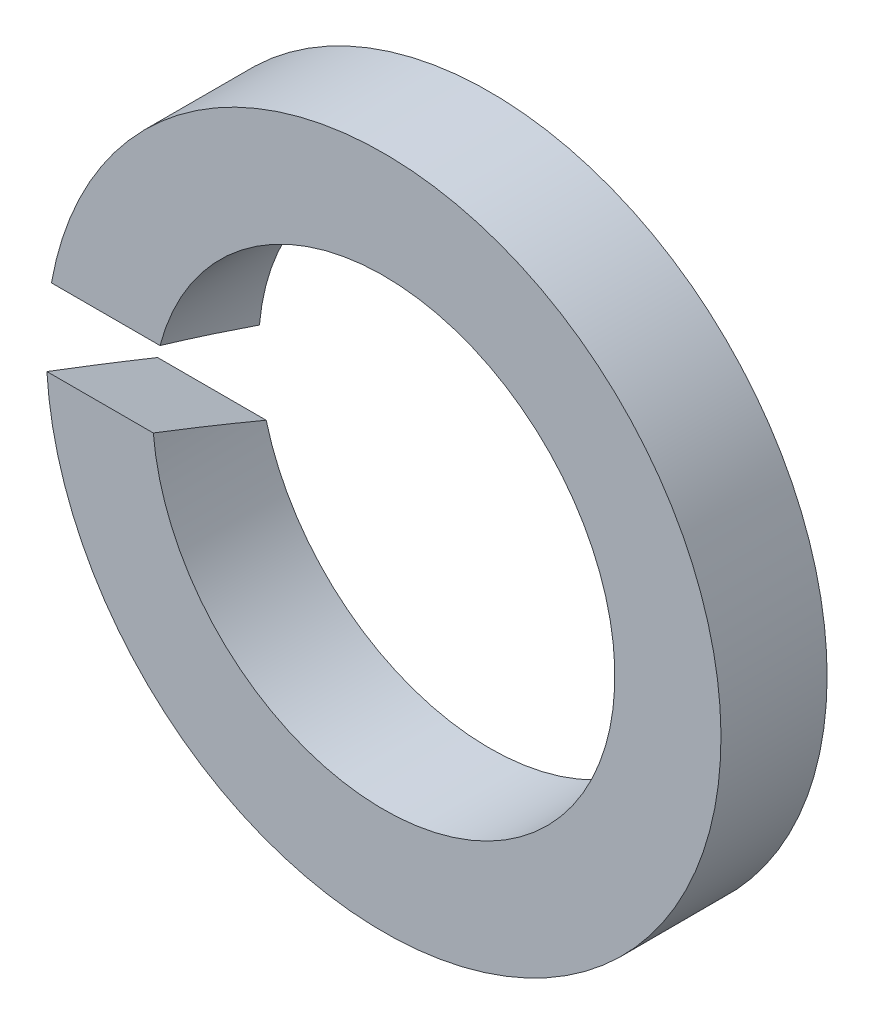
ISO-10303-21;
HEADER;
FILE_DESCRIPTION(('STEP AP214'),'2;1');
FILE_NAME('part.step','',(''),(''),'','','');
FILE_SCHEMA(('AUTOMOTIVE_DESIGN { 1 0 10303 214 1 1 1 1 }'));
ENDSEC;
DATA;
#1=APPLICATION_CONTEXT('core data for automotive mechanical design processes');
#2=APPLICATION_PROTOCOL_DEFINITION('international standard','automotive_design',2000,#1);
#3=PRODUCT_CONTEXT('',#1,'mechanical');
#4=PRODUCT('Part','Part','',(#3));
#5=PRODUCT_RELATED_PRODUCT_CATEGORY('part','',(#4));
#6=PRODUCT_DEFINITION_FORMATION('','',#4);
#7=PRODUCT_DEFINITION_CONTEXT('part definition',#1,'design');
#8=PRODUCT_DEFINITION('design','',#6,#7);
#9=PRODUCT_DEFINITION_SHAPE('','',#8);
#10=(LENGTH_UNIT() NAMED_UNIT(*) SI_UNIT(.MILLI.,.METRE.));
#11=(NAMED_UNIT(*) PLANE_ANGLE_UNIT() SI_UNIT($,.RADIAN.));
#12=(NAMED_UNIT(*) SI_UNIT($,.STERADIAN.) SOLID_ANGLE_UNIT());
#13=UNCERTAINTY_MEASURE_WITH_UNIT(LENGTH_MEASURE(1.E-05),#10,'distance_accuracy_value','');
#14=(GEOMETRIC_REPRESENTATION_CONTEXT(3) GLOBAL_UNCERTAINTY_ASSIGNED_CONTEXT((#13)) GLOBAL_UNIT_ASSIGNED_CONTEXT((#10,
#11,#12)) REPRESENTATION_CONTEXT('',''));
#15=CARTESIAN_POINT('',(0.,0.,0.));
#16=DIRECTION('',(0.,0.,1.));
#17=DIRECTION('',(1.,0.,0.));
#18=AXIS2_PLACEMENT_3D('',#15,#16,#17);
#19=CARTESIAN_POINT('',(0.,0.,1.39999999999996));
#20=DIRECTION('',(0.,0.,0.999999999999999));
#21=DIRECTION('',(1.,0.,0.));
#22=AXIS2_PLACEMENT_3D('',#19,#20,#21);
#23=PLANE('',#22);
#24=DIRECTION('',(1.,0.,0.));
#25=VECTOR('',#24,1.);
#26=CARTESIAN_POINT('',(-4.44999999999995,-0.266667944526899,1.39999999999996));
#27=LINE('',#26,#25);
#28=CARTESIAN_POINT('',(-4.44200272482598,-0.266667944526844,1.39999999999996));
#29=VERTEX_POINT('',#28);
#30=CARTESIAN_POINT('',(-3.03831996461229,-0.266667944526899,1.39999999999996));
#31=VERTEX_POINT('',#30);
#32=EDGE_CURVE('E58',#29,#31,#27,.T.);
#33=ORIENTED_EDGE('',*,*,#32,.F.);
#34=CARTESIAN_POINT('',(0.,0.,1.39999999999996));
#35=DIRECTION('',(0.,0.,0.999999999999999));
#36=DIRECTION('',(1.,0.,0.));
#37=AXIS2_PLACEMENT_3D('',#34,#35,#36);
#38=CIRCLE('',#37,4.45);
#39=CARTESIAN_POINT('',(-4.38177735329866,0.776226272499514,1.39999999999996));
#40=VERTEX_POINT('',#39);
#41=EDGE_CURVE('E90',#29,#40,#38,.T.);
#42=ORIENTED_EDGE('',*,*,#41,.T.);
#43=DIRECTION('',(1.,0.,0.));
#44=VECTOR('',#43,1.);
#45=CARTESIAN_POINT('',(-4.44999999999997,0.776226272499514,1.39999999999996));
#46=LINE('',#45,#44);
#47=CARTESIAN_POINT('',(-2.94957162548751,0.776226272499514,1.39999999999996));
#48=VERTEX_POINT('',#47);
#49=EDGE_CURVE('E102',#40,#48,#46,.T.);
#50=ORIENTED_EDGE('',*,*,#49,.T.);
#51=CARTESIAN_POINT('',(0.,0.,1.39999999999996));
#52=DIRECTION('',(0.,0.,0.999999999999999));
#53=DIRECTION('',(1.,0.,0.));
#54=AXIS2_PLACEMENT_3D('',#51,#52,#53);
#55=CIRCLE('',#54,3.05);
#56=EDGE_CURVE('E94',#31,#48,#55,.T.);
#57=ORIENTED_EDGE('',*,*,#56,.F.);
#58=EDGE_LOOP('',(#33,#42,#50,#57));
#59=FACE_BOUND('',#58,.T.);
#60=ADVANCED_FACE('F36',(#59),#23,.T.);
#61=CARTESIAN_POINT('',(0.,0.,0.));
#62=DIRECTION('',(0.,0.,0.999999999999999));
#63=DIRECTION('',(1.,0.,0.));
#64=AXIS2_PLACEMENT_3D('',#61,#62,#63);
#65=PLANE('',#64);
#66=CARTESIAN_POINT('',(0.,0.,0.));
#67=DIRECTION('',(0.,0.,0.999999999999999));
#68=DIRECTION('',(1.,0.,0.));
#69=AXIS2_PLACEMENT_3D('',#66,#67,#68);
#70=CIRCLE('',#69,4.45);
#71=CARTESIAN_POINT('',(-4.38177735329864,-0.776226272499569,0.));
#72=VERTEX_POINT('',#71);
#73=CARTESIAN_POINT('',(-4.44200272482601,0.266667944526844,0.));
#74=VERTEX_POINT('',#73);
#75=EDGE_CURVE('E88',#72,#74,#70,.T.);
#76=ORIENTED_EDGE('',*,*,#75,.F.);
#77=DIRECTION('',(1.,0.,0.));
#78=VECTOR('',#77,1.);
#79=CARTESIAN_POINT('',(-4.45000000000001,-0.776226272499569,0.));
#80=LINE('',#79,#78);
#81=CARTESIAN_POINT('',(-2.94957162548759,-0.776226272499569,0.));
#82=VERTEX_POINT('',#81);
#83=EDGE_CURVE('E74',#72,#82,#80,.T.);
#84=ORIENTED_EDGE('',*,*,#83,.T.);
#85=CARTESIAN_POINT('',(0.,0.,0.));
#86=DIRECTION('',(0.,0.,0.999999999999999));
#87=DIRECTION('',(1.,0.,0.));
#88=AXIS2_PLACEMENT_3D('',#85,#86,#87);
#89=CIRCLE('',#88,3.05);
#90=CARTESIAN_POINT('',(-3.03831996461226,0.266667944526844,0.));
#91=VERTEX_POINT('',#90);
#92=EDGE_CURVE('E91',#82,#91,#89,.T.);
#93=ORIENTED_EDGE('',*,*,#92,.T.);
#94=DIRECTION('',(1.,0.,0.));
#95=VECTOR('',#94,1.);
#96=CARTESIAN_POINT('',(-4.44999999999998,0.266667944526844,0.));
#97=LINE('',#96,#95);
#98=EDGE_CURVE('E51',#74,#91,#97,.T.);
#99=ORIENTED_EDGE('',*,*,#98,.F.);
#100=EDGE_LOOP('',(#76,#84,#93,#99));
#101=FACE_BOUND('',#100,.T.);
#102=ADVANCED_FACE('F93',(#101),#65,.F.);
#103=CARTESIAN_POINT('',(0.,0.,1.39999999999996));
#104=DIRECTION('',(0.,0.,-0.999999999999999));
#105=DIRECTION('',(-1.,0.,0.));
#106=AXIS2_PLACEMENT_3D('',#103,#104,#105);
#107=CYLINDRICAL_SURFACE('',#106,4.45);
#108=ORIENTED_EDGE('',*,*,#41,.F.);
#109=CARTESIAN_POINT('',(0.,0.,2.13266415607993));
#110=DIRECTION('',(0.,-0.939692620785906,0.342020143325672));
#111=DIRECTION('',(0.,-0.342020143325672,-0.939692620785906));
#112=AXIS2_PLACEMENT_3D('',#109,#110,#111);
#113=ELLIPSE('',#112,13.0109295807256,4.45);
#114=EDGE_CURVE('E77',#29,#72,#113,.T.);
#115=ORIENTED_EDGE('',*,*,#114,.T.);
#116=ORIENTED_EDGE('',*,*,#75,.T.);
#117=CARTESIAN_POINT('',(0.,0.,-0.732664156079865));
#118=DIRECTION('',(0.,0.939692620785906,-0.342020143325672));
#119=DIRECTION('',(0.,-0.342020143325672,-0.939692620785906));
#120=AXIS2_PLACEMENT_3D('',#117,#118,#119);
#121=ELLIPSE('',#120,13.0109295807256,4.45);
#122=EDGE_CURVE('E82',#74,#40,#121,.T.);
#123=ORIENTED_EDGE('',*,*,#122,.T.);
#124=EDGE_LOOP('',(#108,#115,#116,#123));
#125=FACE_BOUND('',#124,.T.);
#126=ADVANCED_FACE('F38',(#125),#107,.T.);
#127=CARTESIAN_POINT('',(0.,0.,1.39999999999996));
#128=DIRECTION('',(0.,0.,-0.999999999999999));
#129=DIRECTION('',(-1.,0.,0.));
#130=AXIS2_PLACEMENT_3D('',#127,#128,#129);
#131=CYLINDRICAL_SURFACE('',#130,3.05);
#132=CARTESIAN_POINT('',(0.,0.,2.13266415607993));
#133=DIRECTION('',(0.,-0.939692620785906,0.342020143325672));
#134=DIRECTION('',(0.,-0.342020143325672,-0.939692620785906));
#135=AXIS2_PLACEMENT_3D('',#132,#133,#134);
#136=ELLIPSE('',#135,8.91760342049732,3.05);
#137=EDGE_CURVE('E11',#31,#82,#136,.T.);
#138=ORIENTED_EDGE('',*,*,#137,.F.);
#139=ORIENTED_EDGE('',*,*,#56,.T.);
#140=CARTESIAN_POINT('',(0.,0.,-0.732664156079865));
#141=DIRECTION('',(0.,0.939692620785906,-0.342020143325672));
#142=DIRECTION('',(0.,-0.342020143325672,-0.939692620785906));
#143=AXIS2_PLACEMENT_3D('',#140,#141,#142);
#144=ELLIPSE('',#143,8.91760342049731,3.05);
#145=EDGE_CURVE('E44',#91,#48,#144,.T.);
#146=ORIENTED_EDGE('',*,*,#145,.F.);
#147=ORIENTED_EDGE('',*,*,#92,.F.);
#148=EDGE_LOOP('',(#138,#139,#146,#147));
#149=FACE_BOUND('',#148,.T.);
#150=ADVANCED_FACE('F107',(#149),#131,.F.);
#151=CARTESIAN_POINT('',(-4.44999999999998,0.266667944526844,0.));
#152=DIRECTION('',(0.,0.939692620785906,-0.342020143325672));
#153=DIRECTION('',(0.,0.342020143325672,0.939692620785906));
#154=AXIS2_PLACEMENT_3D('',#151,#152,#153);
#155=PLANE('',#154);
#156=ORIENTED_EDGE('',*,*,#98,.T.);
#157=ORIENTED_EDGE('',*,*,#145,.T.);
#158=ORIENTED_EDGE('',*,*,#49,.F.);
#159=ORIENTED_EDGE('',*,*,#122,.F.);
#160=EDGE_LOOP('',(#156,#157,#158,#159));
#161=FACE_BOUND('',#160,.T.);
#162=ADVANCED_FACE('F101',(#161),#155,.F.);
#163=CARTESIAN_POINT('',(-4.45000000000001,-0.776226272499569,0.));
#164=DIRECTION('',(0.,-0.939692620785906,0.342020143325672));
#165=DIRECTION('',(0.,-0.342020143325672,-0.939692620785906));
#166=AXIS2_PLACEMENT_3D('',#163,#164,#165);
#167=PLANE('',#166);
#168=ORIENTED_EDGE('',*,*,#32,.T.);
#169=ORIENTED_EDGE('',*,*,#137,.T.);
#170=ORIENTED_EDGE('',*,*,#83,.F.);
#171=ORIENTED_EDGE('',*,*,#114,.F.);
#172=EDGE_LOOP('',(#168,#169,#170,#171));
#173=FACE_BOUND('',#172,.T.);
#174=ADVANCED_FACE('F76',(#173),#167,.F.);
#175=CLOSED_SHELL('',(#60,#102,#126,#150,#162,#174));
#176=MANIFOLD_SOLID_BREP('B2',#175);
#177=ADVANCED_BREP_SHAPE_REPRESENTATION('',(#18,#176),#14);
#178=SHAPE_DEFINITION_REPRESENTATION(#9,#177);
ENDSEC;
END-ISO-10303-21;
